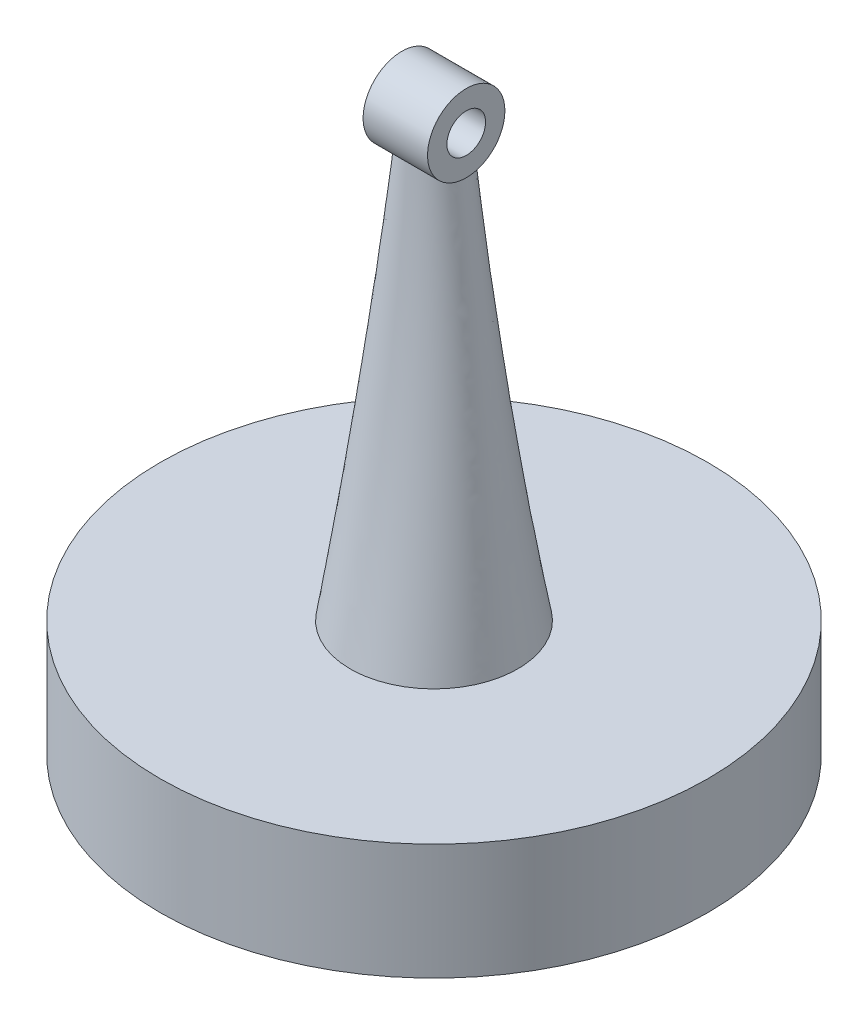
ISO-10303-21;
HEADER;
FILE_DESCRIPTION(('STEP AP214'),'2;1');
FILE_NAME('part.step','',(''),(''),'','','');
FILE_SCHEMA(('AUTOMOTIVE_DESIGN { 1 0 10303 214 1 1 1 1 }'));
ENDSEC;
DATA;
#1=APPLICATION_CONTEXT('core data for automotive mechanical design processes');
#2=APPLICATION_PROTOCOL_DEFINITION('international standard','automotive_design',2000,#1);
#3=PRODUCT_CONTEXT('',#1,'mechanical');
#4=PRODUCT('Part','Part','',(#3));
#5=PRODUCT_RELATED_PRODUCT_CATEGORY('part','',(#4));
#6=PRODUCT_DEFINITION_FORMATION('','',#4);
#7=PRODUCT_DEFINITION_CONTEXT('part definition',#1,'design');
#8=PRODUCT_DEFINITION('design','',#6,#7);
#9=PRODUCT_DEFINITION_SHAPE('','',#8);
#10=(LENGTH_UNIT() NAMED_UNIT(*) SI_UNIT(.MILLI.,.METRE.));
#11=(NAMED_UNIT(*) PLANE_ANGLE_UNIT() SI_UNIT($,.RADIAN.));
#12=(NAMED_UNIT(*) SI_UNIT($,.STERADIAN.) SOLID_ANGLE_UNIT());
#13=UNCERTAINTY_MEASURE_WITH_UNIT(LENGTH_MEASURE(1.E-05),#10,'distance_accuracy_value','');
#14=(GEOMETRIC_REPRESENTATION_CONTEXT(3) GLOBAL_UNCERTAINTY_ASSIGNED_CONTEXT((#13)) GLOBAL_UNIT_ASSIGNED_CONTEXT((#10,
#11,#12)) REPRESENTATION_CONTEXT('',''));
#15=CARTESIAN_POINT('',(0.,0.,0.));
#16=DIRECTION('',(0.,0.,1.));
#17=DIRECTION('',(1.,0.,0.));
#18=AXIS2_PLACEMENT_3D('',#15,#16,#17);
#19=CARTESIAN_POINT('',(0.,4.5,0.));
#20=DIRECTION('',(0.,1.,0.));
#21=DIRECTION('',(0.,0.,1.));
#22=AXIS2_PLACEMENT_3D('',#19,#20,#21);
#23=PLANE('',#22);
#24=CARTESIAN_POINT('',(0.,4.5,0.));
#25=DIRECTION('',(0.,1.,0.));
#26=DIRECTION('',(0.,0.,1.));
#27=AXIS2_PLACEMENT_3D('',#24,#25,#26);
#28=CIRCLE('',#27,10.625);
#29=CARTESIAN_POINT('',(0.,4.5,10.625));
#30=VERTEX_POINT('',#29);
#31=EDGE_CURVE('E114',#30,#30,#28,.T.);
#32=ORIENTED_EDGE('',*,*,#31,.T.);
#33=EDGE_LOOP('',(#32));
#34=FACE_BOUND('',#33,.T.);
#35=CARTESIAN_POINT('',(0.,4.5,-3.25));
#36=CARTESIAN_POINT('',(0.0912846802089727,4.5,-3.25000071384891));
#37=CARTESIAN_POINT('',(0.182555456088959,4.5,-3.24610835724867));
#38=CARTESIAN_POINT('',(0.364461874215807,4.5,-3.23066645020423));
#39=CARTESIAN_POINT('',(0.455097443395268,4.5,-3.21911603300729));
#40=CARTESIAN_POINT('',(0.635152765352755,4.5,-3.18846842788146));
#41=CARTESIAN_POINT('',(0.72457153199309,4.5,-3.16936545678174));
#42=CARTESIAN_POINT('',(0.90156855099382,4.5,-3.12372089182464));
#43=CARTESIAN_POINT('',(0.989145268386166,4.5,-3.09717333939682));
#44=CARTESIAN_POINT('',(1.16180544309777,4.5,-3.0367248320361));
#45=CARTESIAN_POINT('',(1.24688682748485,4.5,-3.00281794954993));
#46=CARTESIAN_POINT('',(1.41388085747047,4.5,-2.92785905125168));
#47=CARTESIAN_POINT('',(1.49579221625999,4.5,-2.88680417027624));
#48=CARTESIAN_POINT('',(1.65586988718602,4.5,-2.7979580011713));
#49=CARTESIAN_POINT('',(1.73403632165484,4.5,-2.75016693328851));
#50=CARTESIAN_POINT('',(1.88608042826509,4.5,-2.64820605985942));
#51=CARTESIAN_POINT('',(1.95995853117264,4.5,-2.59403689665883));
#52=CARTESIAN_POINT('',(2.1027599428855,4.5,-2.47979458482621));
#53=CARTESIAN_POINT('',(2.17169288903125,4.5,-2.41973349140707));
#54=CARTESIAN_POINT('',(2.3041975622261,4.5,-2.29396420587225));
#55=CARTESIAN_POINT('',(2.36776932918828,4.5,-2.22825605580533));
#56=CARTESIAN_POINT('',(2.48912848612572,4.5,-2.09169448204849));
#57=CARTESIAN_POINT('',(2.54691587905579,4.5,-2.02084106098695));
#58=CARTESIAN_POINT('',(2.65634869135947,4.5,-1.87456713581006));
#59=CARTESIAN_POINT('',(2.70799388706089,4.5,-1.79914646552615));
#60=CARTESIAN_POINT('',(2.8531196630038,4.5,-1.56689100066557));
#61=CARTESIAN_POINT('',(2.93696129381346,4.5,-1.40386985804291));
#62=CARTESIAN_POINT('',(3.07575841260001,4.5,-1.06596412670821));
#63=CARTESIAN_POINT('',(3.13071404267958,4.5,-0.89107959636205));
#64=CARTESIAN_POINT('',(3.19074192873012,4.5,-0.62395507958578));
#65=CARTESIAN_POINT('',(3.20701824398946,4.5,-0.534090628429017));
#66=CARTESIAN_POINT('',(3.23200160823505,4.5,-0.353296651991914));
#67=CARTESIAN_POINT('',(3.24070924700119,4.5,-0.262367210259382));
#68=CARTESIAN_POINT('',(3.25039837117542,4.5,-0.0800983287776162));
#69=CARTESIAN_POINT('',(3.25137958961268,4.5,0.0112411250296477));
#70=CARTESIAN_POINT('',(3.24557877662522,4.5,0.193677254504982));
#71=CARTESIAN_POINT('',(3.23879639396653,4.5,0.2847739190021));
#72=CARTESIAN_POINT('',(3.21762394354216,4.5,0.466094122002745));
#73=CARTESIAN_POINT('',(3.20323239417047,4.5,0.55631748697806));
#74=CARTESIAN_POINT('',(3.16695891769491,4.5,0.73524524988662));
#75=CARTESIAN_POINT('',(3.14507703154524,4.5,0.823949656122145));
#76=CARTESIAN_POINT('',(3.09395218855438,4.5,0.999218574483375));
#77=CARTESIAN_POINT('',(3.06470890511298,4.5,1.08578299147784));
#78=CARTESIAN_POINT('',(2.9989656462671,4.5,1.25610716248217));
#79=CARTESIAN_POINT('',(2.9624659178652,4.5,1.33986701184353));
#80=CARTESIAN_POINT('',(2.88248364066378,4.5,1.50407099686784));
#81=CARTESIAN_POINT('',(2.83899551189549,4.5,1.58451241784753));
#82=CARTESIAN_POINT('',(2.7454529779272,4.5,1.74145910226275));
#83=CARTESIAN_POINT('',(2.69539812397415,4.5,1.81796409619511));
#84=CARTESIAN_POINT('',(2.53589697442181,4.5,2.04076285435349));
#85=CARTESIAN_POINT('',(2.41704066065605,4.5,2.18049055862695));
#86=CARTESIAN_POINT('',(2.15714229433992,4.5,2.43791671458985));
#87=CARTESIAN_POINT('',(2.01606894047181,4.5,2.55558356477762));
#88=CARTESIAN_POINT('',(1.79140917323344,4.5,2.71313520447029));
#89=CARTESIAN_POINT('',(1.71430936064099,4.5,2.76251256121052));
#90=CARTESIAN_POINT('',(1.55622362075298,4.5,2.8546368974489));
#91=CARTESIAN_POINT('',(1.47523799818432,4.5,2.89738439575435));
#92=CARTESIAN_POINT('',(1.30991860491805,4.5,2.97585243364101));
#93=CARTESIAN_POINT('',(1.22558426804786,4.5,3.01157177882906));
#94=CARTESIAN_POINT('',(1.05417546596496,4.5,3.07569823487343));
#95=CARTESIAN_POINT('',(0.967100867704903,4.5,3.10410499006642));
#96=CARTESIAN_POINT('',(0.790878917440229,4.5,3.15350443768121));
#97=CARTESIAN_POINT('',(0.701731626315256,4.5,3.17449734757182));
#98=CARTESIAN_POINT('',(0.521992595731525,4.5,3.20894085559109));
#99=CARTESIAN_POINT('',(0.431400871200012,4.5,3.22239153161177));
#100=CARTESIAN_POINT('',(0.249541092095791,4.5,3.2416194351354));
#101=CARTESIAN_POINT('',(0.158274253225655,4.5,3.24740812141692));
#102=CARTESIAN_POINT('',(-0.0244177138241879,4.5,3.25119865316084));
#103=CARTESIAN_POINT('',(-0.115842837075204,4.5,3.2492007368752));
#104=CARTESIAN_POINT('',(-0.298196396213632,4.5,3.23748958669756));
#105=CARTESIAN_POINT('',(-0.389124857868332,4.5,3.22777675696541));
#106=CARTESIAN_POINT('',(-0.569832008446698,4.5,3.20078584704524));
#107=CARTESIAN_POINT('',(-0.659610624338506,4.5,3.18350728875245));
#108=CARTESIAN_POINT('',(-0.926262776209322,4.5,3.12048055813666));
#109=CARTESIAN_POINT('',(-1.10063147408905,4.5,3.06352959719972));
#110=CARTESIAN_POINT('',(-1.43715424865685,4.5,2.9208288396717));
#111=CARTESIAN_POINT('',(-1.59930835031922,4.5,2.83507910196535));
#112=CARTESIAN_POINT('',(-1.82989305362857,4.5,2.68731991937667));
#113=CARTESIAN_POINT('',(-1.90462992560421,4.5,2.63489312212453));
#114=CARTESIAN_POINT('',(-2.04947277883529,4.5,2.52396169121521));
#115=CARTESIAN_POINT('',(-2.11957913197548,4.5,2.46545754661329));
#116=CARTESIAN_POINT('',(-2.25458552174132,4.5,2.34272393230461));
#117=CARTESIAN_POINT('',(-2.31948538372965,4.5,2.27849427070369));
#118=CARTESIAN_POINT('',(-2.44360564411045,4.5,2.14475781179126));
#119=CARTESIAN_POINT('',(-2.5028257481052,4.5,2.07525074127111));
#120=CARTESIAN_POINT('',(-2.61527247851162,4.5,1.93148521308859));
#121=CARTESIAN_POINT('',(-2.66849563716813,4.5,1.85722404487517));
#122=CARTESIAN_POINT('',(-2.76854829188058,4.5,1.70451400109266));
#123=CARTESIAN_POINT('',(-2.81537787201933,4.5,1.62606518061482));
#124=CARTESIAN_POINT('',(-2.90229488262216,4.5,1.46550960313219));
#125=CARTESIAN_POINT('',(-2.94238201836362,4.5,1.38340268642473));
#126=CARTESIAN_POINT('',(-3.01542019043515,4.5,1.21607719635207));
#127=CARTESIAN_POINT('',(-3.04837141570519,4.5,1.13085870544294));
#128=CARTESIAN_POINT('',(-3.10698272774652,4.5,0.957880445487824));
#129=CARTESIAN_POINT('',(-3.13263772244489,4.5,0.870118948505297));
#130=CARTESIAN_POINT('',(-3.17651536917983,4.5,0.692777212659428));
#131=CARTESIAN_POINT('',(-3.19473755526745,4.5,0.603196860144834));
#132=CARTESIAN_POINT('',(-3.23803850224642,4.5,0.332663172786381));
#133=CARTESIAN_POINT('',(-3.25180508169504,4.5,0.14975879654427));
#134=CARTESIAN_POINT('',(-3.24807891844889,4.5,-0.215972844892594));
#135=CARTESIAN_POINT('',(-3.23054463505333,4.5,-0.398799685043931));
#136=CARTESIAN_POINT('',(-3.18166006486843,4.5,-0.668753298671395));
#137=CARTESIAN_POINT('',(-3.16158676864323,4.5,-0.758063891760185));
#138=CARTESIAN_POINT('',(-3.11401620803158,4.5,-0.93470560872154));
#139=CARTESIAN_POINT('',(-3.08651954903825,4.5,-1.02203689338222));
#140=CARTESIAN_POINT('',(-3.02418950220939,4.5,-1.19409494965075));
#141=CARTESIAN_POINT('',(-2.98935176948592,4.5,-1.27882014463496));
#142=CARTESIAN_POINT('',(-2.91259263565545,4.5,-1.44500380355134));
#143=CARTESIAN_POINT('',(-2.87067083868683,4.5,-1.52646208461154));
#144=CARTESIAN_POINT('',(-2.78014173514153,4.5,-1.68556447615707));
#145=CARTESIAN_POINT('',(-2.73153489409073,4.5,-1.76320885172053));
#146=CARTESIAN_POINT('',(-2.62798653459645,4.5,-1.91414989981815));
#147=CARTESIAN_POINT('',(-2.57304514497068,4.5,-1.98744666071837));
#148=CARTESIAN_POINT('',(-2.45727328210678,4.5,-2.12905710851683));
#149=CARTESIAN_POINT('',(-2.39645151755169,4.5,-2.19737790934567));
#150=CARTESIAN_POINT('',(-2.26920759395565,4.5,-2.32858491615858));
#151=CARTESIAN_POINT('',(-2.20278553628877,4.5,-2.39147122047386));
#152=CARTESIAN_POINT('',(-2.06485209449032,4.5,-2.51142272453444));
#153=CARTESIAN_POINT('',(-1.99333976900684,4.5,-2.56848684280008));
#154=CARTESIAN_POINT('',(-1.84581036904288,4.5,-2.67642029759738));
#155=CARTESIAN_POINT('',(-1.76979311971408,4.5,-2.72728939344902));
#156=CARTESIAN_POINT('',(-1.5358276197752,4.5,-2.87000009735231));
#157=CARTESIAN_POINT('',(-1.37177640218664,4.5,-2.95210924333617));
#158=CARTESIAN_POINT('',(-1.03233533356072,4.5,-3.08717701609976));
#159=CARTESIAN_POINT('',(-0.856958964674375,4.5,-3.14016961529373));
#160=CARTESIAN_POINT('',(-0.567086208784126,4.5,-3.20199157628152));
#161=CARTESIAN_POINT('',(-0.454444670160547,4.5,-3.21993147103463));
#162=CARTESIAN_POINT('',(-0.227861516302338,4.5,-3.24393510209999));
#163=CARTESIAN_POINT('',(-0.113919930763991,4.5,-3.24999910914276));
#164=CARTESIAN_POINT('',(0.,4.5,-3.25));
#165=B_SPLINE_CURVE_WITH_KNOTS('',3,(#35,#36,#37,#38,#39,#40,#41,#42,#43,#44,#45,#46,#47,#48,
#49,#50,#51,#52,#53,#54,#55,#56,#57,#58,#59,#60,#61,#62,#63,#64,#65,#66,#67,#68,#69,#70,#71,#72,
#73,#74,#75,#76,#77,#78,#79,#80,#81,#82,#83,#84,#85,#86,#87,#88,#89,#90,#91,#92,#93,#94,#95,#96,
#97,#98,#99,#100,#101,#102,#103,#104,#105,#106,#107,#108,#109,#110,#111,#112,#113,#114,#115,
#116,#117,#118,#119,#120,#121,#122,#123,#124,#125,#126,#127,#128,#129,#130,#131,#132,#133,#134,
#135,#136,#137,#138,#139,#140,#141,#142,#143,#144,#145,#146,#147,#148,#149,#150,#151,#152,#153,
#154,#155,#156,#157,#158,#159,#160,#161,#162,#163,#164),.UNSPECIFIED.,.T.,.F.,(4,2,2,2,2,2,2,2,
2,2,2,2,2,2,2,2,2,2,2,2,2,2,2,2,2,2,2,2,2,2,2,2,2,2,2,2,2,2,2,2,2,2,2,2,2,2,2,2,2,2,2,2,2,2,2,2,
2,2,2,2,2,2,2,2,4),(0.,0.273749915610904,0.547530820008436,0.821521772274105,1.09573265324979,
1.37016522174771,1.64470804656516,1.91924189699743,2.1937481224036,2.46770396458966,
2.74165776704027,3.01561142954741,3.28957506520563,3.83673885463474,4.38389995230438,
4.65761893190405,4.93131658037388,5.20502368587144,5.47874317467348,5.75251597994069,
6.02628728835044,6.30007074520514,6.57384488432338,6.84783871775683,7.12185128498468,
7.66938117052711,8.21768948153722,8.49209485721763,8.76647874896715,9.0409092304413,
9.31535305690313,9.58978883249199,9.86422177380809,10.1382438254032,10.412257492626,
10.6862568060884,10.9602734370226,11.5077756459153,12.0552767353395,12.3288917115458,
12.6024846864855,12.8760868345088,13.1497031564393,13.4234768946885,13.6972470321562,
13.9710291334296,14.2448039847931,14.5187694386194,14.7927520641922,15.340222004223,
15.8884190550506,16.1627726301243,16.4371038377578,16.7115978694077,16.9861072450185,
17.2605975143116,17.5350822026273,17.8091664378666,18.0832457128163,18.3573758060628,
18.6315165460189,19.1790559194683,19.725955074473,20.0675927108526,20.409222558946),.UNSPECIFIED.);
#166=CARTESIAN_POINT('',(0.,4.5,3.25));
#167=VERTEX_POINT('',#166);
#168=EDGE_CURVE('E125',#167,#167,#165,.F.);
#169=ORIENTED_EDGE('',*,*,#168,.F.);
#170=EDGE_LOOP('',(#169));
#171=FACE_BOUND('',#170,.T.);
#172=ADVANCED_FACE('F101',(#34,#171),#23,.T.);
#173=CARTESIAN_POINT('',(0.,4.5,0.));
#174=DIRECTION('',(0.,-1.,0.));
#175=DIRECTION('',(0.,0.,-1.));
#176=AXIS2_PLACEMENT_3D('',#173,#174,#175);
#177=CYLINDRICAL_SURFACE('',#176,10.625);
#178=ORIENTED_EDGE('',*,*,#31,.F.);
#179=EDGE_LOOP('',(#178));
#180=FACE_BOUND('',#179,.T.);
#181=CARTESIAN_POINT('',(0.,0.,0.));
#182=DIRECTION('',(0.,1.,0.));
#183=DIRECTION('',(0.,0.,1.));
#184=AXIS2_PLACEMENT_3D('',#181,#182,#183);
#185=CIRCLE('',#184,10.625);
#186=CARTESIAN_POINT('',(0.,0.,10.625));
#187=VERTEX_POINT('',#186);
#188=EDGE_CURVE('E119',#187,#187,#185,.T.);
#189=ORIENTED_EDGE('',*,*,#188,.T.);
#190=EDGE_LOOP('',(#189));
#191=FACE_BOUND('',#190,.T.);
#192=ADVANCED_FACE('F103',(#180,#191),#177,.T.);
#193=CARTESIAN_POINT('',(0.,0.,0.));
#194=DIRECTION('',(0.,1.,0.));
#195=DIRECTION('',(0.,0.,1.));
#196=AXIS2_PLACEMENT_3D('',#193,#194,#195);
#197=PLANE('',#196);
#198=ORIENTED_EDGE('',*,*,#188,.F.);
#199=EDGE_LOOP('',(#198));
#200=FACE_BOUND('',#199,.T.);
#201=ADVANCED_FACE('F142',(#200),#197,.F.);
#202=CARTESIAN_POINT('',(0.,4.5,3.25));
#203=CARTESIAN_POINT('',(0.,10.1132782619094,2.06548844313632));
#204=CARTESIAN_POINT('',(0.,15.779944928576,1.31548844313632));
#205=CARTESIAN_POINT('',(0.,21.5,1.));
#206=CARTESIAN_POINT('',(0.425424001778769,4.5,3.25));
#207=CARTESIAN_POINT('',(0.327249232137515,10.1132782619094,2.06548844313632));
#208=CARTESIAN_POINT('',(0.22907446249626,15.779944928576,1.31548844313632));
#209=CARTESIAN_POINT('',(0.130899692855006,21.5,1.));
#210=CARTESIAN_POINT('',(1.27614833744665,4.5,3.08092960990622));
#211=CARTESIAN_POINT('',(0.981514501949693,10.1132782619093,1.96197517023888));
#212=CARTESIAN_POINT('',(0.686880666452738,15.779944928576,1.25037531513125));
#213=CARTESIAN_POINT('',(0.392246830955783,21.5,0.946130044583316));
#214=CARTESIAN_POINT('',(2.35801521501567,4.5,2.35797984284854));
#215=CARTESIAN_POINT('',(1.81416493539685,10.1132782619093,1.50875649768062));
#216=CARTESIAN_POINT('',(1.27031465577803,15.779944928576,0.965049090932483));
#217=CARTESIAN_POINT('',(0.726464376159205,21.5,0.726857622604118));
#218=CARTESIAN_POINT('',(3.08087701531351,4.5,1.27615740686224));
#219=CARTESIAN_POINT('',(2.36939545697395,10.1132782619093,0.81858313380649));
#220=CARTESIAN_POINT('',(1.6579138986344,15.779944928576,0.523950694574621));
#221=CARTESIAN_POINT('',(0.946432340294839,21.5,0.392260089166632));
#222=CARTESIAN_POINT('',(3.33473058832127,4.5,0.));
#223=CARTESIAN_POINT('',(2.56577170124608,10.1132782619094,0.));
#224=CARTESIAN_POINT('',(1.7968128141709,15.779944928576,0.));
#225=CARTESIAN_POINT('',(1.02785392709571,21.5,0.));
#226=CARTESIAN_POINT('',(3.0808770153135,4.50000000000001,-1.27615740686225));
#227=CARTESIAN_POINT('',(2.36939545697395,10.1132782619094,-0.818583133806495));
#228=CARTESIAN_POINT('',(1.65791389863439,15.779944928576,-0.523950694574623));
#229=CARTESIAN_POINT('',(0.94643234029484,21.5,-0.392260089166632));
#230=CARTESIAN_POINT('',(2.35801521501566,4.49999999999999,-2.35797984284854));
#231=CARTESIAN_POINT('',(1.81416493539685,10.1132782619093,-1.50875649768062));
#232=CARTESIAN_POINT('',(1.27031465577803,15.779944928576,-0.965049090932483));
#233=CARTESIAN_POINT('',(0.726464376159206,21.5,-0.726857622604119));
#234=CARTESIAN_POINT('',(1.27614833744665,4.50000000000001,-3.08092960990622));
#235=CARTESIAN_POINT('',(0.981514501949691,10.1132782619094,-1.96197517023889));
#236=CARTESIAN_POINT('',(0.686880666452738,15.779944928576,-1.25037531513125));
#237=CARTESIAN_POINT('',(0.392246830955784,21.5,-0.946130044583316));
#238=CARTESIAN_POINT('',(0.425424001778769,4.5,-3.25));
#239=CARTESIAN_POINT('',(0.327249232137515,10.1132782619093,-2.06548844313632));
#240=CARTESIAN_POINT('',(0.22907446249626,15.779944928576,-1.31548844313632));
#241=CARTESIAN_POINT('',(0.130899692855006,21.5,-1.));
#242=CARTESIAN_POINT('',(-0.425424001778769,4.5,-3.25));
#243=CARTESIAN_POINT('',(-0.327249232137515,10.1132782619093,-2.06548844313632));
#244=CARTESIAN_POINT('',(-0.22907446249626,15.779944928576,-1.31548844313632));
#245=CARTESIAN_POINT('',(-0.130899692855006,21.5,-1.));
#246=CARTESIAN_POINT('',(-1.27614833744664,4.5,-3.08092960990622));
#247=CARTESIAN_POINT('',(-0.98151450194969,10.1132782619093,-1.96197517023888));
#248=CARTESIAN_POINT('',(-0.686880666452737,15.779944928576,-1.25037531513125));
#249=CARTESIAN_POINT('',(-0.392246830955783,21.5,-0.946130044583316));
#250=CARTESIAN_POINT('',(-2.35801521501567,4.49999999999999,-2.35797984284854));
#251=CARTESIAN_POINT('',(-1.81416493539685,10.1132782619093,-1.50875649768062));
#252=CARTESIAN_POINT('',(-1.27031465577803,15.779944928576,-0.965049090932483));
#253=CARTESIAN_POINT('',(-0.726464376159205,21.5,-0.726857622604119));
#254=CARTESIAN_POINT('',(-3.0808770153135,4.5,-1.27615740686224));
#255=CARTESIAN_POINT('',(-2.36939545697395,10.1132782619094,-0.818583133806491));
#256=CARTESIAN_POINT('',(-1.65791389863439,15.779944928576,-0.523950694574621));
#257=CARTESIAN_POINT('',(-0.946432340294839,21.5,-0.392260089166632));
#258=CARTESIAN_POINT('',(-3.33473058832127,4.5,0.));
#259=CARTESIAN_POINT('',(-2.56577170124608,10.1132782619094,0.));
#260=CARTESIAN_POINT('',(-1.7968128141709,15.779944928576,0.));
#261=CARTESIAN_POINT('',(-1.02785392709571,21.5,0.));
#262=CARTESIAN_POINT('',(-3.08087701531351,4.50000000000001,1.27615740686225));
#263=CARTESIAN_POINT('',(-2.36939545697395,10.1132782619094,0.818583133806496));
#264=CARTESIAN_POINT('',(-1.6579138986344,15.779944928576,0.523950694574624));
#265=CARTESIAN_POINT('',(-0.946432340294839,21.5,0.392260089166632));
#266=CARTESIAN_POINT('',(-2.35801521501566,4.49999999999999,2.35797984284854));
#267=CARTESIAN_POINT('',(-1.81416493539684,10.1132782619093,1.50875649768062));
#268=CARTESIAN_POINT('',(-1.27031465577802,15.779944928576,0.965049090932482));
#269=CARTESIAN_POINT('',(-0.726464376159205,21.5,0.726857622604119));
#270=CARTESIAN_POINT('',(-1.27614833744665,4.50000000000001,3.08092960990622));
#271=CARTESIAN_POINT('',(-0.981514501949694,10.1132782619094,1.96197517023888));
#272=CARTESIAN_POINT('',(-0.686880666452739,15.779944928576,1.25037531513125));
#273=CARTESIAN_POINT('',(-0.392246830955783,21.5,0.946130044583316));
#274=CARTESIAN_POINT('',(-0.425424001778769,4.5,3.25));
#275=CARTESIAN_POINT('',(-0.327249232137515,10.1132782619094,2.06548844313632));
#276=CARTESIAN_POINT('',(-0.22907446249626,15.779944928576,1.31548844313632));
#277=CARTESIAN_POINT('',(-0.130899692855006,21.5,1.));
#278=CARTESIAN_POINT('',(0.,4.5,3.25));
#279=CARTESIAN_POINT('',(0.,10.1132782619094,2.06548844313632));
#280=CARTESIAN_POINT('',(0.,15.779944928576,1.31548844313632));
#281=CARTESIAN_POINT('',(0.,21.5,1.));
#282=B_SPLINE_SURFACE_WITH_KNOTS('',3,3,((#202,#203,#204,#205),(#206,#207,#208,#209),(#210,#211,
#212,#213),(#214,#215,#216,#217),(#218,#219,#220,#221),(#222,#223,#224,#225),(#226,#227,#228,
#229),(#230,#231,#232,#233),(#234,#235,#236,#237),(#238,#239,#240,#241),(#242,#243,#244,#245),
(#246,#247,#248,#249),(#250,#251,#252,#253),(#254,#255,#256,#257),(#258,#259,#260,#261),(#262,
#263,#264,#265),(#266,#267,#268,#269),(#270,#271,#272,#273),(#274,#275,#276,#277),(#278,#279,
#280,#281)),.UNSPECIFIED.,.T.,.F.,.F.,(4,1,1,1,1,1,1,1,2,1,1,1,1,1,1,1,4),(4,4),(0.,0.0625,
0.125,0.1875,0.25,0.3125,0.375,0.4375,0.5,0.5625,0.625,0.6875,0.75,0.8125,0.875,0.9375,1.),(0.,
1.),.UNSPECIFIED.);
#283=CARTESIAN_POINT('',(0.,20.4420325546461,1.06334607939815));
#284=CARTESIAN_POINT('',(0.0303552537500032,20.4420344685166,1.06334697385148));
#285=CARTESIAN_POINT('',(0.0607027615639361,20.4409263212223,1.06224888160823));
#286=CARTESIAN_POINT('',(0.121102178065463,20.4366171141552,1.05793463245232));
#287=CARTESIAN_POINT('',(0.151153956590631,20.4334151712718,1.0547175818118));
#288=CARTESIAN_POINT('',(0.240623240723092,20.4209540142891,1.04202016577622));
#289=CARTESIAN_POINT('',(0.299237154661573,20.4088408388531,1.02949423361779));
#290=CARTESIAN_POINT('',(0.412231387841361,20.3794704995688,0.997432881476029));
#291=CARTESIAN_POINT('',(0.466653527995319,20.3622757707658,0.977981983944125));
#292=CARTESIAN_POINT('',(0.571554143829982,20.3247913190253,0.932604667568277));
#293=CARTESIAN_POINT('',(0.622032468095041,20.3045014773448,0.906678000259145));
#294=CARTESIAN_POINT('',(0.728992609330905,20.2580082551407,0.842236794115222));
#295=CARTESIAN_POINT('',(0.784432123086703,20.2314713068498,0.802214351197114));
#296=CARTESIAN_POINT('',(0.887336597544079,20.1790511015824,0.712581286144077));
#297=CARTESIAN_POINT('',(0.93480637484421,20.1531674578702,0.662976494479888));
#298=CARTESIAN_POINT('',(1.01038195938312,20.1106769696908,0.567323122764001));
#299=CARTESIAN_POINT('',(1.04042287974223,20.0933134288276,0.523136132791859));
#300=CARTESIAN_POINT('',(1.09380883575597,20.0620412620252,0.429750584868062));
#301=CARTESIAN_POINT('',(1.11716243624816,20.0481282199203,0.380558547665646));
#302=CARTESIAN_POINT('',(1.15236199390519,20.027066888154,0.286973289688491));
#303=CARTESIAN_POINT('',(1.16550464071366,20.0191619589921,0.243239587173661));
#304=CARTESIAN_POINT('',(1.18538198243517,20.0072292281402,0.153812869066984));
#305=CARTESIAN_POINT('',(1.19212411307338,20.0031969274055,0.108122191649555));
#306=CARTESIAN_POINT('',(1.19694015872179,20.0003282719052,0.0390336995436873));
#307=CARTESIAN_POINT('',(1.19765793331063,19.9999048680148,0.0158555906428996));
#308=CARTESIAN_POINT('',(1.19727775611451,20.0001307807288,-0.0304806099694003));
#309=CARTESIAN_POINT('',(1.1961797819885,20.0007801105321,-0.0536387014311092));
#310=CARTESIAN_POINT('',(1.19023252034221,20.0043258496435,-0.122809544356008));
#311=CARTESIAN_POINT('',(1.18273147208512,20.0088190461279,-0.168542634475058));
#312=CARTESIAN_POINT('',(1.16190352359355,20.0213258692176,-0.255679973122181));
#313=CARTESIAN_POINT('',(1.14887987749955,20.029156340977,-0.297186534877946));
#314=CARTESIAN_POINT('',(1.11783678278166,20.0477176614572,-0.377598174370928));
#315=CARTESIAN_POINT('',(1.09981428984568,20.0584502774919,-0.416501648843007));
#316=CARTESIAN_POINT('',(1.05041355160619,20.0875253331684,-0.508082160267019));
#317=CARTESIAN_POINT('',(1.01667338959873,20.107119828694,-0.559089623295999));
#318=CARTESIAN_POINT('',(0.941976513842297,20.1491557936795,-0.654160782897192));
#319=CARTESIAN_POINT('',(0.901010354475948,20.1716009785945,-0.69821524611601));
#320=CARTESIAN_POINT('',(0.812202734425663,20.2176160446702,-0.779557673829477));
#321=CARTESIAN_POINT('',(0.764273401627234,20.2411972416934,-0.816742764912642));
#322=CARTESIAN_POINT('',(0.6630116837599,20.2872846143023,-0.883727188509654));
#323=CARTESIAN_POINT('',(0.609675519208284,20.309790021492,-0.913521303733062));
#324=CARTESIAN_POINT('',(0.499120687899211,20.3513750114304,-0.965268551751552));
#325=CARTESIAN_POINT('',(0.441970490513163,20.3705000252471,-0.987330344106883));
#326=CARTESIAN_POINT('',(0.323769007460205,20.4032401149262,-1.02358164079084));
#327=CARTESIAN_POINT('',(0.262726618912362,20.4168672698846,-1.03778842873497));
#328=CARTESIAN_POINT('',(0.149113788600374,20.4342785245252,-1.05563685123015));
#329=CARTESIAN_POINT('',(0.0969875277987069,20.4393896797106,-1.06071640905071));
#330=CARTESIAN_POINT('',(0.0185089410684913,20.4421669568815,-1.06347900428609));
#331=CARTESIAN_POINT('',(-0.00769655304785798,20.4422780044579,-1.06359060880235));
#332=CARTESIAN_POINT('',(-0.0600214249631954,20.4408767467336,-1.06219540962634));
#333=CARTESIAN_POINT('',(-0.0861407948135312,20.4393642955819,-1.06068846052731));
#334=CARTESIAN_POINT('',(-0.163868017838132,20.4325436226018,-1.05384197530205));
#335=CARTESIAN_POINT('',(-0.215096359728976,20.424959528969,-1.04618470204858));
#336=CARTESIAN_POINT('',(-0.315436927509503,20.4049672270279,-1.02523560595213));
#337=CARTESIAN_POINT('',(-0.364544004376573,20.3925479410631,-1.01193083806525));
#338=CARTESIAN_POINT('',(-0.48081620067194,20.3582141087398,-0.97326719652979));
#339=CARTESIAN_POINT('',(-0.546567253455118,20.3345179524405,-0.945182840061428));
#340=CARTESIAN_POINT('',(-0.640238794060577,20.296609995175,-0.895705316652225));
#341=CARTESIAN_POINT('',(-0.670668810785016,20.2835637494957,-0.877963088271631));
#342=CARTESIAN_POINT('',(-0.729762728542908,20.257050822869,-0.84000761012912));
#343=CARTESIAN_POINT('',(-0.758427045434647,20.2435842420536,-0.819794945577701));
#344=CARTESIAN_POINT('',(-0.814015202646586,20.2164705068252,-0.776663056397183));
#345=CARTESIAN_POINT('',(-0.840921910673584,20.2028227964824,-0.753722003637446));
#346=CARTESIAN_POINT('',(-0.892513878315309,20.1758681181485,-0.70529776362671));
#347=CARTESIAN_POINT('',(-0.917198609302956,20.1625612317782,-0.679813974461841));
#348=CARTESIAN_POINT('',(-0.987574602430535,20.1238455344149,-0.599744374751668));
#349=CARTESIAN_POINT('',(-1.02979185694028,20.0995372460893,-0.541383254847136));
#350=CARTESIAN_POINT('',(-1.08998186883683,20.0642851029195,-0.436667110902057));
#351=CARTESIAN_POINT('',(-1.1113410670926,20.0515904476906,-0.392823680998952));
#352=CARTESIAN_POINT('',(-1.14763915538365,20.0299077292033,-0.301688464616805));
#353=CARTESIAN_POINT('',(-1.16258487954426,20.0209157208615,-0.254400411879897));
#354=CARTESIAN_POINT('',(-1.18506128465501,20.0074210675495,-0.156960428100972));
#355=CARTESIAN_POINT('',(-1.19252782413477,20.0029572522846,-0.106787561584085));
#356=CARTESIAN_POINT('',(-1.19731263293837,20.0001063745365,-0.0310455161087555));
#357=CARTESIAN_POINT('',(-1.1978378198375,19.9997972399041,-0.00571216056291307));
#358=CARTESIAN_POINT('',(-1.19672584133727,20.0004585856809,0.0448898090705571));
#359=CARTESIAN_POINT('',(-1.19508879844963,20.0014289935913,0.0701584267449503));
#360=CARTESIAN_POINT('',(-1.18773925134209,20.0058170443225,0.139048353009388));
#361=CARTESIAN_POINT('',(-1.17990444025936,20.0105160260465,0.182379884036344));
#362=CARTESIAN_POINT('',(-1.15854671175767,20.0233424616731,0.267069272483274));
#363=CARTESIAN_POINT('',(-1.14501869434314,20.0314729895864,0.308425323182254));
#364=CARTESIAN_POINT('',(-1.10793279111963,20.0536265668376,0.40116818479644));
#365=CARTESIAN_POINT('',(-1.08255473647538,20.0687005764941,0.451577608244527));
#366=CARTESIAN_POINT('',(-1.0248326498542,20.1023377278481,0.546909125568851));
#367=CARTESIAN_POINT('',(-0.992479703001937,20.1209053309394,0.591824080513049));
#368=CARTESIAN_POINT('',(-0.913427267540718,20.1648323760966,0.686026434720973));
#369=CARTESIAN_POINT('',(-0.865151219900544,20.1907470767443,0.733733884689949));
#370=CARTESIAN_POINT('',(-0.760923220394864,20.2428332508427,0.819807276397781));
#371=CARTESIAN_POINT('',(-0.704956737832397,20.2690051211546,0.85815514354041));
#372=CARTESIAN_POINT('',(-0.585963881785685,20.3193319869095,0.926188452379724));
#373=CARTESIAN_POINT('',(-0.522848366916018,20.343452976567,0.955742841265591));
#374=CARTESIAN_POINT('',(-0.391072624156088,20.3858587327557,1.00486283757486));
#375=CARTESIAN_POINT('',(-0.322431001863764,20.4041621346066,1.02446046246928));
#376=CARTESIAN_POINT('',(-0.210770917537122,20.4253836633446,1.04657741697158));
#377=CARTESIAN_POINT('',(-0.169087790383721,20.4315348796573,1.0528123891839));
#378=CARTESIAN_POINT('',(-0.0849306971877551,20.4398555321146,1.061193574117));
#379=CARTESIAN_POINT('',(-0.0424577717110267,20.4420298777232,1.06334482832988));
#380=CARTESIAN_POINT('',(0.,20.4420325546461,1.06334607939815));
#381=B_SPLINE_CURVE_WITH_KNOTS('',3,(#283,#284,#285,#286,#287,#288,#289,#290,#291,#292,#293,
#294,#295,#296,#297,#298,#299,#300,#301,#302,#303,#304,#305,#306,#307,#308,#309,#310,#311,#312,
#313,#314,#315,#316,#317,#318,#319,#320,#321,#322,#323,#324,#325,#326,#327,#328,#329,#330,#331,
#332,#333,#334,#335,#336,#337,#338,#339,#340,#341,#342,#343,#344,#345,#346,#347,#348,#349,#350,
#351,#352,#353,#354,#355,#356,#357,#358,#359,#360,#361,#362,#363,#364,#365,#366,#367,#368,#369,
#370,#371,#372,#373,#374,#375,#376,#377,#378,#379,#380),.UNSPECIFIED.,.T.,.F.,(4,2,2,2,2,2,2,2,
2,2,2,2,2,2,2,2,2,2,2,2,2,2,2,2,2,2,2,2,2,2,2,2,2,2,2,2,2,2,2,2,2,2,2,2,2,2,2,2,4),(0.,
0.0910127377503323,0.182063887179618,0.364513069920869,0.544807694344683,0.72510923745499,
0.944172093939354,1.16310207702376,1.33105280579392,1.49878745828575,1.63726595322298,
1.77558337479567,1.84507787052577,1.91457322132541,2.0534934429363,2.185611287648,
2.31780976984096,2.50943354937818,2.70130969583819,2.89586029811065,3.09054784535482,
3.28237808809608,3.47378454363989,3.63086069215524,3.70938545233642,3.7879172675727,
3.94423602707927,4.10091504801448,4.32560325096864,4.43820564688347,4.55078142043463,
4.66432757197955,4.77790066610616,5.00422402348299,5.15486237079404,5.30533979856555,
5.45709694716437,5.53300847229739,5.6089156964754,5.74112816702806,5.87345932695969,
6.04775017278005,6.22226512123313,6.43908978951105,6.65632991957223,6.87666185165781,
7.0962807163258,7.22373731990968,7.35103647128636),.UNSPECIFIED.);
#382=CARTESIAN_POINT('',(0.,20.4420325546461,1.06334607939816));
#383=VERTEX_POINT('',#382);
#384=EDGE_CURVE('E12',#383,#383,#381,.T.);
#385=CARTESIAN_POINT('',(0.,20.4420325546461,1.06334607939816));
#386=CARTESIAN_POINT('',(0.,20.3582720360136,1.06875710686317));
#387=CARTESIAN_POINT('',(0.,20.2745175727386,1.07426187142236));
#388=CARTESIAN_POINT('',(0.,20.1070315992964,1.08545821914182));
#389=CARTESIAN_POINT('',(0.,20.0233000875701,1.09114977897776));
#390=CARTESIAN_POINT('',(0.,19.8558600171698,1.10271971710531));
#391=CARTESIAN_POINT('',(0.,19.772151456949,1.10859807301043));
#392=CARTESIAN_POINT('',(0.,19.6047572895591,1.12054160212581));
#393=CARTESIAN_POINT('',(0.,19.5210716808597,1.1266067538884));
#394=CARTESIAN_POINT('',(0.,19.3537234164922,1.13892387383642));
#395=CARTESIAN_POINT('',(0.,19.2700607593145,1.14517582151374));
#396=CARTESIAN_POINT('',(0.,19.1027583979697,1.15786653233607));
#397=CARTESIAN_POINT('',(0.,19.0191186923182,1.16430527591325));
#398=CARTESIAN_POINT('',(0.,18.8518622339995,1.1773695775988));
#399=CARTESIAN_POINT('',(0.,18.7682454798775,1.18399511708027));
#400=CARTESIAN_POINT('',(0.,18.6010349245877,1.19743300963205));
#401=CARTESIAN_POINT('',(0.,18.5174411219986,1.20424534501702));
#402=CARTESIAN_POINT('',(0.,18.3502764697405,1.21805682843424));
#403=CARTESIAN_POINT('',(0.,18.2667056186881,1.22505595972326));
#404=CARTESIAN_POINT('',(0.,18.0995868694645,1.23924103400612));
#405=CARTESIAN_POINT('',(0.,18.0160389699521,1.24642696119934));
#406=CARTESIAN_POINT('',(0.,17.8489661237659,1.26098562634777));
#407=CARTESIAN_POINT('',(0.,17.7654411757972,1.2683583494454));
#408=CARTESIAN_POINT('',(0.,17.5984142326511,1.28329060545936));
#409=CARTESIAN_POINT('',(0.,17.5149122362297,1.29085012446153));
#410=CARTESIAN_POINT('',(0.,17.3479311961266,1.30615597134097));
#411=CARTESIAN_POINT('',(0.,17.264452151256,1.31390228624779));
#412=CARTESIAN_POINT('',(0.,17.0975170141986,1.32958172399262));
#413=CARTESIAN_POINT('',(0.,17.0140609208824,1.33751483480417));
#414=CARTESIAN_POINT('',(0.,16.8471716868737,1.35356786341427));
#415=CARTESIAN_POINT('',(0.,16.7637385451153,1.36168777013059));
#416=CARTESIAN_POINT('',(0.,16.5968952141581,1.37811438960585));
#417=CARTESIAN_POINT('',(0.,16.5134850239612,1.38642109222693));
#418=CARTESIAN_POINT('',(0.,16.3466875960583,1.40322130256721));
#419=CARTESIAN_POINT('',(0.,16.2633003574264,1.41171480109301));
#420=CARTESIAN_POINT('',(0.,16.0965488325806,1.42888860229815));
#421=CARTESIAN_POINT('',(0.,16.0131845455173,1.43756889672858));
#422=CARTESIAN_POINT('',(0.,15.8464789237315,1.45511628879839));
#423=CARTESIAN_POINT('',(0.,15.7631375882402,1.46398337913334));
#424=CARTESIAN_POINT('',(0.,15.5964778695173,1.48190436206763));
#425=CARTESIAN_POINT('',(0.,15.5131594856017,1.49095824830694));
#426=CARTESIAN_POINT('',(0.,15.3465456699443,1.5092528221055));
#427=CARTESIAN_POINT('',(0.,15.2632502376079,1.51849350424897));
#428=CARTESIAN_POINT('',(0.,15.0966823250191,1.53716166891155));
#429=CARTESIAN_POINT('',(0.,15.0134098442654,1.54658914695895));
#430=CARTESIAN_POINT('',(0.,14.8468878347479,1.5656309024853));
#431=CARTESIAN_POINT('',(0.,14.7636383055805,1.57524517643637));
#432=CARTESIAN_POINT('',(0.,14.5971621991371,1.59466052282621));
#433=CARTESIAN_POINT('',(0.,14.5139356215595,1.60446159268062));
#434=CARTESIAN_POINT('',(0.,14.347505418193,1.62425052993366));
#435=CARTESIAN_POINT('',(0.,14.2643017922089,1.63423839569107));
#436=CARTESIAN_POINT('',(0.,14.0979174919222,1.654400923807));
#437=CARTESIAN_POINT('',(0.,14.0147368175349,1.66457558546703));
#438=CARTESIAN_POINT('',(0.,13.8483984203308,1.6851117044455));
#439=CARTESIAN_POINT('',(0.,13.765240697544,1.69547316200772));
#440=CARTESIAN_POINT('',(0.,13.5989482034253,1.7163828718484));
#441=CARTESIAN_POINT('',(0.,13.5158134322424,1.72693112531235));
#442=CARTESIAN_POINT('',(0.,13.3495668412119,1.74821442601486));
#443=CARTESIAN_POINT('',(0.,13.2664550216366,1.75894947538004));
#444=CARTESIAN_POINT('',(0.,13.1002543336971,1.78060636694398));
#445=CARTESIAN_POINT('',(0.,13.0171654657327,1.79152821220985));
#446=CARTESIAN_POINT('',(0.,12.8510106808871,1.81355869463483));
#447=CARTESIAN_POINT('',(0.,12.7679447645372,1.82466733580082));
#448=CARTESIAN_POINT('',(0.,12.6018358827883,1.8470714090864));
#449=CARTESIAN_POINT('',(0.,12.5187929180564,1.85836684615189));
#450=CARTESIAN_POINT('',(0.,12.352729939407,1.88114451029763));
#451=CARTESIAN_POINT('',(0.,12.2697099262965,1.89262674326197));
#452=CARTESIAN_POINT('',(0.,12.1036928507494,1.91577799826741));
#453=CARTESIAN_POINT('',(0.,12.0206957892639,1.92744702712991));
#454=CARTESIAN_POINT('',(0.,11.8547246168218,1.95097187299456));
#455=CARTESIAN_POINT('',(0.,11.7717505069648,1.96282769775449));
#456=CARTESIAN_POINT('',(0.,11.6058252376306,1.98672613447785));
#457=CARTESIAN_POINT('',(0.,11.5228740794055,1.99876875513446));
#458=CARTESIAN_POINT('',(0.,11.3569947131819,2.023040782716));
#459=CARTESIAN_POINT('',(0.,11.2740665065922,2.03527019926848));
#460=CARTESIAN_POINT('',(0.,11.1082330434821,2.05991581770767));
#461=CARTESIAN_POINT('',(0.,11.0253277885312,2.07233203015518));
#462=CARTESIAN_POINT('',(0.,10.8595402285373,2.09735123945146));
#463=CARTESIAN_POINT('',(0.,10.7766579252287,2.10995424779313));
#464=CARTESIAN_POINT('',(0.,10.6109162683538,2.13534704794593));
#465=CARTESIAN_POINT('',(0.,10.5280569166909,2.14813685218084));
#466=CARTESIAN_POINT('',(0.,10.3623611629378,2.17390324318955));
#467=CARTESIAN_POINT('',(0.,10.279524762924,2.18687984331676));
#468=CARTESIAN_POINT('',(0.,10.1138749122954,2.21301982518078));
#469=CARTESIAN_POINT('',(0.,10.0310614639342,2.22618322119929));
#470=CARTESIAN_POINT('',(0.,9.86545751643283,2.25269679391799));
#471=CARTESIAN_POINT('',(0.,9.7826670197276,2.26604698582678));
#472=CARTESIAN_POINT('',(0.,9.61710897535628,2.29293414939951));
#473=CARTESIAN_POINT('',(0.,9.53434143031041,2.30647113719753));
#474=CARTESIAN_POINT('',(0.,9.36882928907185,2.33373189162361));
#475=CARTESIAN_POINT('',(0.,9.28608469568873,2.34745567530977));
#476=CARTESIAN_POINT('',(0.,9.12061845758568,2.37509002058852));
#477=CARTESIAN_POINT('',(0.,9.03789681586867,2.38900060016167));
#478=CARTESIAN_POINT('',(0.,8.87247648090386,2.41700853629239));
#479=CARTESIAN_POINT('',(0.,8.78977779085633,2.43110591175138));
#480=CARTESIAN_POINT('',(0.,8.62440335903247,2.45948743873335));
#481=CARTESIAN_POINT('',(0.,8.54172762065776,2.47377161007696));
#482=CARTESIAN_POINT('',(0.,8.37639909197757,2.50252672790943));
#483=CARTESIAN_POINT('',(0.,8.29374630527903,2.51699769513644));
#484=CARTESIAN_POINT('',(0.,8.12846367974522,2.54612640381866));
#485=CARTESIAN_POINT('',(0.,8.04583384472616,2.56078416692778));
#486=CARTESIAN_POINT('',(0.,7.88059712234143,2.59028646645898));
#487=CARTESIAN_POINT('',(0.,7.79799023900516,2.6051310254489));
#488=CARTESIAN_POINT('',(0.,7.63279941977219,2.63500691582829));
#489=CARTESIAN_POINT('',(0.,7.55021548812201,2.65003827069766));
#490=CARTESIAN_POINT('',(0.,7.3850705720435,2.68028775192443));
#491=CARTESIAN_POINT('',(0.,7.30250959208269,2.69550590267187));
#492=CARTESIAN_POINT('',(0.,7.1374105791613,2.72612897474519));
#493=CARTESIAN_POINT('',(0.,7.05487255089313,2.7415339213693));
#494=CARTESIAN_POINT('',(0.,6.88981944113153,2.77253058428832));
#495=CARTESIAN_POINT('',(0.,6.80730436455926,2.78812232678764));
#496=CARTESIAN_POINT('',(0.,6.6422971579601,2.8194925805515));
#497=CARTESIAN_POINT('',(0.,6.55980503308695,2.83527111892453));
#498=CARTESIAN_POINT('',(0.,6.3948437296529,2.8670149635324));
#499=CARTESIAN_POINT('',(0.,6.31237455648212,2.8829802977777));
#500=CARTESIAN_POINT('',(0.,6.14745915621573,2.91509773322849));
#501=CARTESIAN_POINT('',(0.,6.06501293475043,2.93124986334422));
#502=CARTESIAN_POINT('',(0.,5.90014343765463,2.96374088963775));
#503=CARTESIAN_POINT('',(0.,5.81772016789841,2.98007981562333));
#504=CARTESIAN_POINT('',(0.,5.65289657397469,3.01294443275595));
#505=CARTESIAN_POINT('',(0.,5.57049625592917,3.02947015460605));
#506=CARTESIAN_POINT('',(0.,5.40571856518438,3.06270836258697));
#507=CARTESIAN_POINT('',(0.,5.32334119885853,3.0794208803138));
#508=CARTESIAN_POINT('',(0.,5.15860941127939,3.11303267910416));
#509=CARTESIAN_POINT('',(0.,5.07625499665466,3.12993199265427));
#510=CARTESIAN_POINT('',(0.,4.91156911230301,3.16391738239453));
#511=CARTESIAN_POINT('',(0.,4.82923764946349,3.18100349195942));
#512=CARTESIAN_POINT('',(0.,4.66459766812073,3.21536247212064));
#513=CARTESIAN_POINT('',(0.,4.58228915676731,3.23263537697722));
#514=CARTESIAN_POINT('',(0.,4.5,3.25));
#515=B_SPLINE_CURVE_WITH_KNOTS('',3,(#385,#386,#387,#388,#389,#390,#391,#392,#393,#394,#395,
#396,#397,#398,#399,#400,#401,#402,#403,#404,#405,#406,#407,#408,#409,#410,#411,#412,#413,#414,
#415,#416,#417,#418,#419,#420,#421,#422,#423,#424,#425,#426,#427,#428,#429,#430,#431,#432,#433,
#434,#435,#436,#437,#438,#439,#440,#441,#442,#443,#444,#445,#446,#447,#448,#449,#450,#451,#452,
#453,#454,#455,#456,#457,#458,#459,#460,#461,#462,#463,#464,#465,#466,#467,#468,#469,#470,#471,
#472,#473,#474,#475,#476,#477,#478,#479,#480,#481,#482,#483,#484,#485,#486,#487,#488,#489,#490,
#491,#492,#493,#494,#495,#496,#497,#498,#499,#500,#501,#502,#503,#504,#505,#506,#507,#508,#509,
#510,#511,#512,#513,#514),.UNSPECIFIED.,.F.,.F.,(4,2,2,2,2,2,2,2,2,2,2,2,2,2,2,2,2,2,2,2,2,2,2,
2,2,2,2,2,2,2,2,2,2,2,2,2,2,2,2,2,2,2,2,2,2,2,2,2,2,2,2,2,2,2,2,2,2,2,2,2,2,2,2,2,4),(0.,
0.251805295717763,0.503579268290605,0.755323180084226,1.00703829391659,1.25872587303914,
1.51038718111797,1.76202348221493,2.0136360407688,2.2652261215763,2.5167949897732,
2.76834391081534,3.01987415045959,3.2713869747449,3.52288364997321,3.77436544269041,
4.02583361966726,4.27728944788031,4.52873419449277,4.78016912683539,5.03159551238734,
5.28301461875705,5.53442771366303,5.78583606491477,6.03724094039348,6.28864360803299,
6.54004533580053,6.79144739167753,7.04285104364048,7.29425755964172,7.54566820759023,
7.7970842553325,8.04850697063333,8.29993762115665,8.5513774744464,8.80282779790731,
9.05428985878582,9.30576492415092,9.55725426087504,9.80875913561496,10.0602808147927,
10.3118205645764,10.5633796508616,10.8149593392515,11.0665608950388,11.3181855831862,
11.5698346683074,11.8215094146486,12.0732110860691,12.3249409460229,12.5767002575393,
12.8284902832045,13.080312285143,13.3321675249981,13.5840572639141,13.8359827625168,
14.0879452808956,14.3399460785843,14.591986414543,14.8440675471393,15.09619073413,
15.3483572326426,15.600568299157,15.8528251894869,16.1051291587621),.UNSPECIFIED.);
#516=EDGE_CURVE('BSEAM136',#383,#167,#515,.T.);
#517=ORIENTED_EDGE('',*,*,#384,.F.);
#518=ORIENTED_EDGE('',*,*,#168,.T.);
#519=ORIENTED_EDGE('',*,*,#516,.T.);
#520=ORIENTED_EDGE('',*,*,#516,.F.);
#521=EDGE_LOOP('',(#517,#519,#518,#520));
#522=FACE_BOUND('',#521,.T.);
#523=ADVANCED_FACE('F136',(#522),#282,.T.);
#524=CARTESIAN_POINT('',(-1.25,21.5,0.));
#525=DIRECTION('',(1.,0.,0.));
#526=DIRECTION('',(0.,0.,-1.));
#527=AXIS2_PLACEMENT_3D('',#524,#525,#526);
#528=CYLINDRICAL_SURFACE('',#527,1.5);
#529=ORIENTED_EDGE('',*,*,#384,.T.);
#530=EDGE_LOOP('',(#529));
#531=FACE_BOUND('',#530,.T.);
#532=CARTESIAN_POINT('',(-1.25,21.5,0.));
#533=DIRECTION('',(1.,0.,0.));
#534=DIRECTION('',(0.,0.,-1.));
#535=AXIS2_PLACEMENT_3D('',#532,#533,#534);
#536=CIRCLE('',#535,1.5);
#537=CARTESIAN_POINT('',(-1.25,21.5,-1.5));
#538=VERTEX_POINT('',#537);
#539=EDGE_CURVE('E128',#538,#538,#536,.T.);
#540=ORIENTED_EDGE('',*,*,#539,.T.);
#541=EDGE_LOOP('',(#540));
#542=FACE_BOUND('',#541,.T.);
#543=CARTESIAN_POINT('',(1.25,21.5,0.));
#544=DIRECTION('',(1.,0.,0.));
#545=DIRECTION('',(0.,0.,-1.));
#546=AXIS2_PLACEMENT_3D('',#543,#544,#545);
#547=CIRCLE('',#546,1.5);
#548=CARTESIAN_POINT('',(1.25,21.5,-1.5));
#549=VERTEX_POINT('',#548);
#550=EDGE_CURVE('E219',#549,#549,#547,.T.);
#551=ORIENTED_EDGE('',*,*,#550,.F.);
#552=EDGE_LOOP('',(#551));
#553=FACE_BOUND('',#552,.T.);
#554=ADVANCED_FACE('F149',(#531,#542,#553),#528,.T.);
#555=CARTESIAN_POINT('',(-1.25,21.5,0.));
#556=DIRECTION('',(1.,0.,0.));
#557=DIRECTION('',(0.,0.,-1.));
#558=AXIS2_PLACEMENT_3D('',#555,#556,#557);
#559=PLANE('',#558);
#560=CARTESIAN_POINT('',(-1.25,21.5,0.));
#561=DIRECTION('',(1.,0.,0.));
#562=DIRECTION('',(0.,0.,-1.));
#563=AXIS2_PLACEMENT_3D('',#560,#561,#562);
#564=CIRCLE('',#563,0.75);
#565=CARTESIAN_POINT('',(-1.25,21.5,-0.75));
#566=VERTEX_POINT('',#565);
#567=EDGE_CURVE('E227',#566,#566,#564,.T.);
#568=ORIENTED_EDGE('',*,*,#567,.T.);
#569=EDGE_LOOP('',(#568));
#570=FACE_BOUND('',#569,.T.);
#571=ORIENTED_EDGE('',*,*,#539,.F.);
#572=EDGE_LOOP('',(#571));
#573=FACE_BOUND('',#572,.T.);
#574=ADVANCED_FACE('F181',(#570,#573),#559,.F.);
#575=CARTESIAN_POINT('',(-1.25,21.5,0.));
#576=DIRECTION('',(1.,0.,0.));
#577=DIRECTION('',(0.,0.,-1.));
#578=AXIS2_PLACEMENT_3D('',#575,#576,#577);
#579=CYLINDRICAL_SURFACE('',#578,0.75);
#580=ORIENTED_EDGE('',*,*,#567,.F.);
#581=EDGE_LOOP('',(#580));
#582=FACE_BOUND('',#581,.T.);
#583=CARTESIAN_POINT('',(1.25,21.5,0.));
#584=DIRECTION('',(1.,0.,0.));
#585=DIRECTION('',(0.,0.,-1.));
#586=AXIS2_PLACEMENT_3D('',#583,#584,#585);
#587=CIRCLE('',#586,0.75);
#588=CARTESIAN_POINT('',(1.25,21.5,-0.75));
#589=VERTEX_POINT('',#588);
#590=EDGE_CURVE('E222',#589,#589,#587,.T.);
#591=ORIENTED_EDGE('',*,*,#590,.T.);
#592=EDGE_LOOP('',(#591));
#593=FACE_BOUND('',#592,.T.);
#594=ADVANCED_FACE('F189',(#582,#593),#579,.F.);
#595=CARTESIAN_POINT('',(1.25,21.5,0.));
#596=DIRECTION('',(1.,0.,0.));
#597=DIRECTION('',(0.,0.,-1.));
#598=AXIS2_PLACEMENT_3D('',#595,#596,#597);
#599=PLANE('',#598);
#600=ORIENTED_EDGE('',*,*,#550,.T.);
#601=EDGE_LOOP('',(#600));
#602=FACE_BOUND('',#601,.T.);
#603=ORIENTED_EDGE('',*,*,#590,.F.);
#604=EDGE_LOOP('',(#603));
#605=FACE_BOUND('',#604,.T.);
#606=ADVANCED_FACE('F201',(#602,#605),#599,.T.);
#607=CLOSED_SHELL('',(#172,#192,#201,#523,#554,#574,#594,#606));
#608=MANIFOLD_SOLID_BREP('B2',#607);
#609=ADVANCED_BREP_SHAPE_REPRESENTATION('',(#18,#608),#14);
#610=SHAPE_DEFINITION_REPRESENTATION(#9,#609);
ENDSEC;
END-ISO-10303-21;
